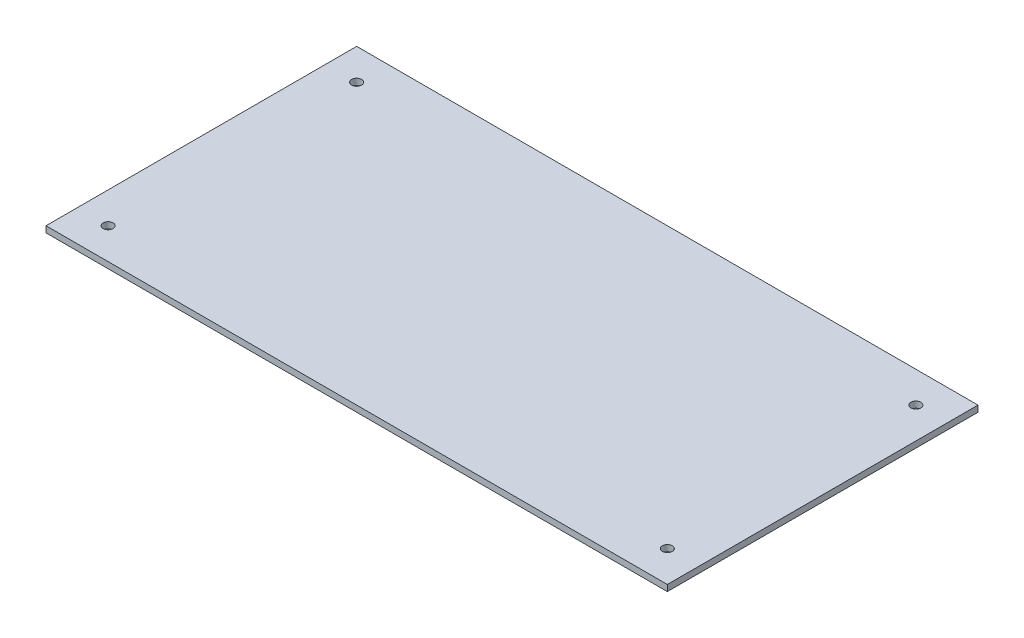
ISO-10303-21;
HEADER;
FILE_DESCRIPTION(('STEP AP214'),'2;1');
FILE_NAME('part.step','',(''),(''),'','','');
FILE_SCHEMA(('AUTOMOTIVE_DESIGN { 1 0 10303 214 1 1 1 1 }'));
ENDSEC;
DATA;
#1=APPLICATION_CONTEXT('core data for automotive mechanical design processes');
#2=APPLICATION_PROTOCOL_DEFINITION('international standard','automotive_design',2000,#1);
#3=PRODUCT_CONTEXT('',#1,'mechanical');
#4=PRODUCT('Part','Part','',(#3));
#5=PRODUCT_RELATED_PRODUCT_CATEGORY('part','',(#4));
#6=PRODUCT_DEFINITION_FORMATION('','',#4);
#7=PRODUCT_DEFINITION_CONTEXT('part definition',#1,'design');
#8=PRODUCT_DEFINITION('design','',#6,#7);
#9=PRODUCT_DEFINITION_SHAPE('','',#8);
#10=(LENGTH_UNIT() NAMED_UNIT(*) SI_UNIT(.MILLI.,.METRE.));
#11=(NAMED_UNIT(*) PLANE_ANGLE_UNIT() SI_UNIT($,.RADIAN.));
#12=(NAMED_UNIT(*) SI_UNIT($,.STERADIAN.) SOLID_ANGLE_UNIT());
#13=UNCERTAINTY_MEASURE_WITH_UNIT(LENGTH_MEASURE(1.E-05),#10,'distance_accuracy_value','');
#14=(GEOMETRIC_REPRESENTATION_CONTEXT(3) GLOBAL_UNCERTAINTY_ASSIGNED_CONTEXT((#13)) GLOBAL_UNIT_ASSIGNED_CONTEXT((#10,
#11,#12)) REPRESENTATION_CONTEXT('',''));
#15=CARTESIAN_POINT('',(0.,0.,0.));
#16=DIRECTION('',(0.,0.,1.));
#17=DIRECTION('',(1.,0.,0.));
#18=AXIS2_PLACEMENT_3D('',#15,#16,#17);
#19=CARTESIAN_POINT('',(100.,2.,50.));
#20=DIRECTION('',(-1.,0.,0.));
#21=DIRECTION('',(0.,0.,1.));
#22=AXIS2_PLACEMENT_3D('',#19,#20,#21);
#23=PLANE('',#22);
#24=DIRECTION('',(0.,0.,-1.));
#25=VECTOR('',#24,1.);
#26=CARTESIAN_POINT('',(100.,0.,50.));
#27=LINE('',#26,#25);
#28=CARTESIAN_POINT('',(100.,0.,50.));
#29=VERTEX_POINT('',#28);
#30=CARTESIAN_POINT('',(100.,0.,-50.));
#31=VERTEX_POINT('',#30);
#32=EDGE_CURVE('E97',#29,#31,#27,.T.);
#33=ORIENTED_EDGE('',*,*,#32,.T.);
#34=DIRECTION('',(0.,-1.,0.));
#35=VECTOR('',#34,1.);
#36=CARTESIAN_POINT('',(100.,2.,-50.));
#37=LINE('',#36,#35);
#38=CARTESIAN_POINT('',(100.,2.,-50.));
#39=VERTEX_POINT('',#38);
#40=EDGE_CURVE('E11',#39,#31,#37,.T.);
#41=ORIENTED_EDGE('',*,*,#40,.F.);
#42=DIRECTION('',(0.,0.,-1.));
#43=VECTOR('',#42,1.);
#44=CARTESIAN_POINT('',(100.,2.,50.));
#45=LINE('',#44,#43);
#46=CARTESIAN_POINT('',(100.,2.,50.));
#47=VERTEX_POINT('',#46);
#48=EDGE_CURVE('E85',#47,#39,#45,.T.);
#49=ORIENTED_EDGE('',*,*,#48,.F.);
#50=DIRECTION('',(0.,-1.,0.));
#51=VECTOR('',#50,1.);
#52=CARTESIAN_POINT('',(100.,2.,50.));
#53=LINE('',#52,#51);
#54=EDGE_CURVE('E93',#47,#29,#53,.T.);
#55=ORIENTED_EDGE('',*,*,#54,.T.);
#56=EDGE_LOOP('',(#33,#41,#49,#55));
#57=FACE_BOUND('',#56,.T.);
#58=ADVANCED_FACE('F34',(#57),#23,.F.);
#59=CARTESIAN_POINT('',(-100.,2.,-50.));
#60=DIRECTION('',(0.,0.,1.));
#61=DIRECTION('',(1.,0.,0.));
#62=AXIS2_PLACEMENT_3D('',#59,#60,#61);
#63=PLANE('',#62);
#64=DIRECTION('',(-1.,0.,0.));
#65=VECTOR('',#64,1.);
#66=CARTESIAN_POINT('',(-100.,0.,-50.));
#67=LINE('',#66,#65);
#68=CARTESIAN_POINT('',(-100.,0.,-50.));
#69=VERTEX_POINT('',#68);
#70=EDGE_CURVE('E89',#31,#69,#67,.T.);
#71=ORIENTED_EDGE('',*,*,#70,.T.);
#72=DIRECTION('',(0.,-1.,0.));
#73=VECTOR('',#72,1.);
#74=CARTESIAN_POINT('',(-100.,2.,-50.));
#75=LINE('',#74,#73);
#76=CARTESIAN_POINT('',(-100.,2.,-50.));
#77=VERTEX_POINT('',#76);
#78=EDGE_CURVE('E42',#77,#69,#75,.T.);
#79=ORIENTED_EDGE('',*,*,#78,.F.);
#80=DIRECTION('',(-1.,0.,0.));
#81=VECTOR('',#80,1.);
#82=CARTESIAN_POINT('',(-100.,2.,-50.));
#83=LINE('',#82,#81);
#84=EDGE_CURVE('E80',#39,#77,#83,.T.);
#85=ORIENTED_EDGE('',*,*,#84,.F.);
#86=ORIENTED_EDGE('',*,*,#40,.T.);
#87=EDGE_LOOP('',(#71,#79,#85,#86));
#88=FACE_BOUND('',#87,.T.);
#89=ADVANCED_FACE('F88',(#88),#63,.F.);
#90=CARTESIAN_POINT('',(-100.,2.,50.));
#91=DIRECTION('',(1.,0.,0.));
#92=DIRECTION('',(0.,0.,-1.));
#93=AXIS2_PLACEMENT_3D('',#90,#91,#92);
#94=PLANE('',#93);
#95=DIRECTION('',(0.,0.,1.));
#96=VECTOR('',#95,1.);
#97=CARTESIAN_POINT('',(-100.,0.,50.));
#98=LINE('',#97,#96);
#99=CARTESIAN_POINT('',(-100.,0.,50.));
#100=VERTEX_POINT('',#99);
#101=EDGE_CURVE('E67',#69,#100,#98,.T.);
#102=ORIENTED_EDGE('',*,*,#101,.T.);
#103=DIRECTION('',(0.,-1.,0.));
#104=VECTOR('',#103,1.);
#105=CARTESIAN_POINT('',(-100.,2.,50.));
#106=LINE('',#105,#104);
#107=CARTESIAN_POINT('',(-100.,2.,50.));
#108=VERTEX_POINT('',#107);
#109=EDGE_CURVE('E90',#108,#100,#106,.T.);
#110=ORIENTED_EDGE('',*,*,#109,.F.);
#111=DIRECTION('',(0.,0.,1.));
#112=VECTOR('',#111,1.);
#113=CARTESIAN_POINT('',(-100.,2.,50.));
#114=LINE('',#113,#112);
#115=EDGE_CURVE('E83',#77,#108,#114,.T.);
#116=ORIENTED_EDGE('',*,*,#115,.F.);
#117=ORIENTED_EDGE('',*,*,#78,.T.);
#118=EDGE_LOOP('',(#102,#110,#116,#117));
#119=FACE_BOUND('',#118,.T.);
#120=ADVANCED_FACE('F91',(#119),#94,.F.);
#121=CARTESIAN_POINT('',(-100.,2.,50.));
#122=DIRECTION('',(0.,0.,-1.));
#123=DIRECTION('',(-1.,0.,0.));
#124=AXIS2_PLACEMENT_3D('',#121,#122,#123);
#125=PLANE('',#124);
#126=DIRECTION('',(1.,0.,0.));
#127=VECTOR('',#126,1.);
#128=CARTESIAN_POINT('',(-100.,0.,50.));
#129=LINE('',#128,#127);
#130=EDGE_CURVE('E73',#100,#29,#129,.T.);
#131=ORIENTED_EDGE('',*,*,#130,.T.);
#132=ORIENTED_EDGE('',*,*,#54,.F.);
#133=DIRECTION('',(1.,0.,0.));
#134=VECTOR('',#133,1.);
#135=CARTESIAN_POINT('',(-100.,2.,50.));
#136=LINE('',#135,#134);
#137=EDGE_CURVE('E50',#108,#47,#136,.T.);
#138=ORIENTED_EDGE('',*,*,#137,.F.);
#139=ORIENTED_EDGE('',*,*,#109,.T.);
#140=EDGE_LOOP('',(#131,#132,#138,#139));
#141=FACE_BOUND('',#140,.T.);
#142=ADVANCED_FACE('F105',(#141),#125,.F.);
#143=CARTESIAN_POINT('',(0.,2.,0.));
#144=DIRECTION('',(0.,-1.,0.));
#145=DIRECTION('',(0.,0.,-1.));
#146=AXIS2_PLACEMENT_3D('',#143,#144,#145);
#147=PLANE('',#146);
#148=CARTESIAN_POINT('',(-90.,2.,40.));
#149=DIRECTION('',(0.,1.,0.));
#150=DIRECTION('',(0.,0.,-1.));
#151=AXIS2_PLACEMENT_3D('',#148,#149,#150);
#152=CIRCLE('',#151,1.60000000000001);
#153=CARTESIAN_POINT('',(-90.,2.,38.4));
#154=VERTEX_POINT('',#153);
#155=EDGE_CURVE('E117',#154,#154,#152,.T.);
#156=ORIENTED_EDGE('',*,*,#155,.F.);
#157=EDGE_LOOP('',(#156));
#158=FACE_BOUND('',#157,.T.);
#159=CARTESIAN_POINT('',(90.,2.,40.));
#160=DIRECTION('',(0.,1.,0.));
#161=DIRECTION('',(0.,0.,1.));
#162=AXIS2_PLACEMENT_3D('',#159,#160,#161);
#163=CIRCLE('',#162,1.60000000000001);
#164=CARTESIAN_POINT('',(90.,2.,41.6));
#165=VERTEX_POINT('',#164);
#166=EDGE_CURVE('E123',#165,#165,#163,.T.);
#167=ORIENTED_EDGE('',*,*,#166,.F.);
#168=EDGE_LOOP('',(#167));
#169=FACE_BOUND('',#168,.T.);
#170=CARTESIAN_POINT('',(90.,2.,-40.));
#171=DIRECTION('',(0.,1.,0.));
#172=DIRECTION('',(0.,0.,-1.));
#173=AXIS2_PLACEMENT_3D('',#170,#171,#172);
#174=CIRCLE('',#173,1.60000000000001);
#175=CARTESIAN_POINT('',(90.,2.,-41.6));
#176=VERTEX_POINT('',#175);
#177=EDGE_CURVE('E129',#176,#176,#174,.T.);
#178=ORIENTED_EDGE('',*,*,#177,.F.);
#179=EDGE_LOOP('',(#178));
#180=FACE_BOUND('',#179,.T.);
#181=CARTESIAN_POINT('',(-90.,2.,-40.));
#182=DIRECTION('',(0.,1.,0.));
#183=DIRECTION('',(0.,0.,1.));
#184=AXIS2_PLACEMENT_3D('',#181,#182,#183);
#185=CIRCLE('',#184,1.60000000000001);
#186=CARTESIAN_POINT('',(-90.,2.,-38.4));
#187=VERTEX_POINT('',#186);
#188=EDGE_CURVE('E111',#187,#187,#185,.T.);
#189=ORIENTED_EDGE('',*,*,#188,.F.);
#190=EDGE_LOOP('',(#189));
#191=FACE_BOUND('',#190,.T.);
#192=ORIENTED_EDGE('',*,*,#48,.T.);
#193=ORIENTED_EDGE('',*,*,#84,.T.);
#194=ORIENTED_EDGE('',*,*,#115,.T.);
#195=ORIENTED_EDGE('',*,*,#137,.T.);
#196=EDGE_LOOP('',(#192,#193,#194,#195));
#197=FACE_BOUND('',#196,.T.);
#198=ADVANCED_FACE('F81',(#158,#169,#180,#191,#197),#147,.F.);
#199=CARTESIAN_POINT('',(0.,0.,0.));
#200=DIRECTION('',(0.,-1.,0.));
#201=DIRECTION('',(0.,0.,-1.));
#202=AXIS2_PLACEMENT_3D('',#199,#200,#201);
#203=PLANE('',#202);
#204=CARTESIAN_POINT('',(-90.,0.,40.));
#205=DIRECTION('',(0.,1.,0.));
#206=DIRECTION('',(0.,0.,-1.));
#207=AXIS2_PLACEMENT_3D('',#204,#205,#206);
#208=CIRCLE('',#207,1.60000000000001);
#209=CARTESIAN_POINT('',(-90.,0.,38.4));
#210=VERTEX_POINT('',#209);
#211=EDGE_CURVE('E120',#210,#210,#208,.T.);
#212=ORIENTED_EDGE('',*,*,#211,.T.);
#213=EDGE_LOOP('',(#212));
#214=FACE_BOUND('',#213,.T.);
#215=CARTESIAN_POINT('',(90.,0.,40.));
#216=DIRECTION('',(0.,1.,0.));
#217=DIRECTION('',(0.,0.,1.));
#218=AXIS2_PLACEMENT_3D('',#215,#216,#217);
#219=CIRCLE('',#218,1.60000000000001);
#220=CARTESIAN_POINT('',(90.,0.,41.6));
#221=VERTEX_POINT('',#220);
#222=EDGE_CURVE('E126',#221,#221,#219,.T.);
#223=ORIENTED_EDGE('',*,*,#222,.T.);
#224=EDGE_LOOP('',(#223));
#225=FACE_BOUND('',#224,.T.);
#226=CARTESIAN_POINT('',(90.,0.,-40.));
#227=DIRECTION('',(0.,1.,0.));
#228=DIRECTION('',(0.,0.,-1.));
#229=AXIS2_PLACEMENT_3D('',#226,#227,#228);
#230=CIRCLE('',#229,1.60000000000001);
#231=CARTESIAN_POINT('',(90.,0.,-41.6));
#232=VERTEX_POINT('',#231);
#233=EDGE_CURVE('E114',#232,#232,#230,.T.);
#234=ORIENTED_EDGE('',*,*,#233,.T.);
#235=EDGE_LOOP('',(#234));
#236=FACE_BOUND('',#235,.T.);
#237=CARTESIAN_POINT('',(-90.,0.,-40.));
#238=DIRECTION('',(0.,1.,0.));
#239=DIRECTION('',(0.,0.,1.));
#240=AXIS2_PLACEMENT_3D('',#237,#238,#239);
#241=CIRCLE('',#240,1.60000000000001);
#242=CARTESIAN_POINT('',(-90.,0.,-38.4));
#243=VERTEX_POINT('',#242);
#244=EDGE_CURVE('E100',#243,#243,#241,.T.);
#245=ORIENTED_EDGE('',*,*,#244,.T.);
#246=EDGE_LOOP('',(#245));
#247=FACE_BOUND('',#246,.T.);
#248=ORIENTED_EDGE('',*,*,#32,.F.);
#249=ORIENTED_EDGE('',*,*,#130,.F.);
#250=ORIENTED_EDGE('',*,*,#101,.F.);
#251=ORIENTED_EDGE('',*,*,#70,.F.);
#252=EDGE_LOOP('',(#248,#249,#250,#251));
#253=FACE_BOUND('',#252,.T.);
#254=ADVANCED_FACE('F108',(#214,#225,#236,#247,#253),#203,.T.);
#255=CARTESIAN_POINT('',(-90.,0.,-40.));
#256=DIRECTION('',(0.,1.,0.));
#257=DIRECTION('',(0.,0.,1.));
#258=AXIS2_PLACEMENT_3D('',#255,#256,#257);
#259=CYLINDRICAL_SURFACE('',#258,1.60000000000001);
#260=ORIENTED_EDGE('',*,*,#244,.F.);
#261=EDGE_LOOP('',(#260));
#262=FACE_BOUND('',#261,.T.);
#263=ORIENTED_EDGE('',*,*,#188,.T.);
#264=EDGE_LOOP('',(#263));
#265=FACE_BOUND('',#264,.T.);
#266=ADVANCED_FACE('F141',(#262,#265),#259,.F.);
#267=CARTESIAN_POINT('',(90.,0.,-40.));
#268=DIRECTION('',(0.,1.,0.));
#269=DIRECTION('',(0.,0.,1.));
#270=AXIS2_PLACEMENT_3D('',#267,#268,#269);
#271=CYLINDRICAL_SURFACE('',#270,1.60000000000001);
#272=ORIENTED_EDGE('',*,*,#233,.F.);
#273=EDGE_LOOP('',(#272));
#274=FACE_BOUND('',#273,.T.);
#275=ORIENTED_EDGE('',*,*,#177,.T.);
#276=EDGE_LOOP('',(#275));
#277=FACE_BOUND('',#276,.T.);
#278=ADVANCED_FACE('F137',(#274,#277),#271,.F.);
#279=CARTESIAN_POINT('',(90.,0.,40.));
#280=DIRECTION('',(0.,1.,0.));
#281=DIRECTION('',(0.,0.,1.));
#282=AXIS2_PLACEMENT_3D('',#279,#280,#281);
#283=CYLINDRICAL_SURFACE('',#282,1.60000000000001);
#284=ORIENTED_EDGE('',*,*,#222,.F.);
#285=EDGE_LOOP('',(#284));
#286=FACE_BOUND('',#285,.T.);
#287=ORIENTED_EDGE('',*,*,#166,.T.);
#288=EDGE_LOOP('',(#287));
#289=FACE_BOUND('',#288,.T.);
#290=ADVANCED_FACE('F140',(#286,#289),#283,.F.);
#291=CARTESIAN_POINT('',(-90.,0.,40.));
#292=DIRECTION('',(0.,1.,0.));
#293=DIRECTION('',(0.,0.,1.));
#294=AXIS2_PLACEMENT_3D('',#291,#292,#293);
#295=CYLINDRICAL_SURFACE('',#294,1.60000000000001);
#296=ORIENTED_EDGE('',*,*,#211,.F.);
#297=EDGE_LOOP('',(#296));
#298=FACE_BOUND('',#297,.T.);
#299=ORIENTED_EDGE('',*,*,#155,.T.);
#300=EDGE_LOOP('',(#299));
#301=FACE_BOUND('',#300,.T.);
#302=ADVANCED_FACE('F202',(#298,#301),#295,.F.);
#303=CLOSED_SHELL('',(#58,#89,#120,#142,#198,#254,#266,#278,#290,#302));
#304=MANIFOLD_SOLID_BREP('B2',#303);
#305=ADVANCED_BREP_SHAPE_REPRESENTATION('',(#18,#304),#14);
#306=SHAPE_DEFINITION_REPRESENTATION(#9,#305);
ENDSEC;
END-ISO-10303-21;
